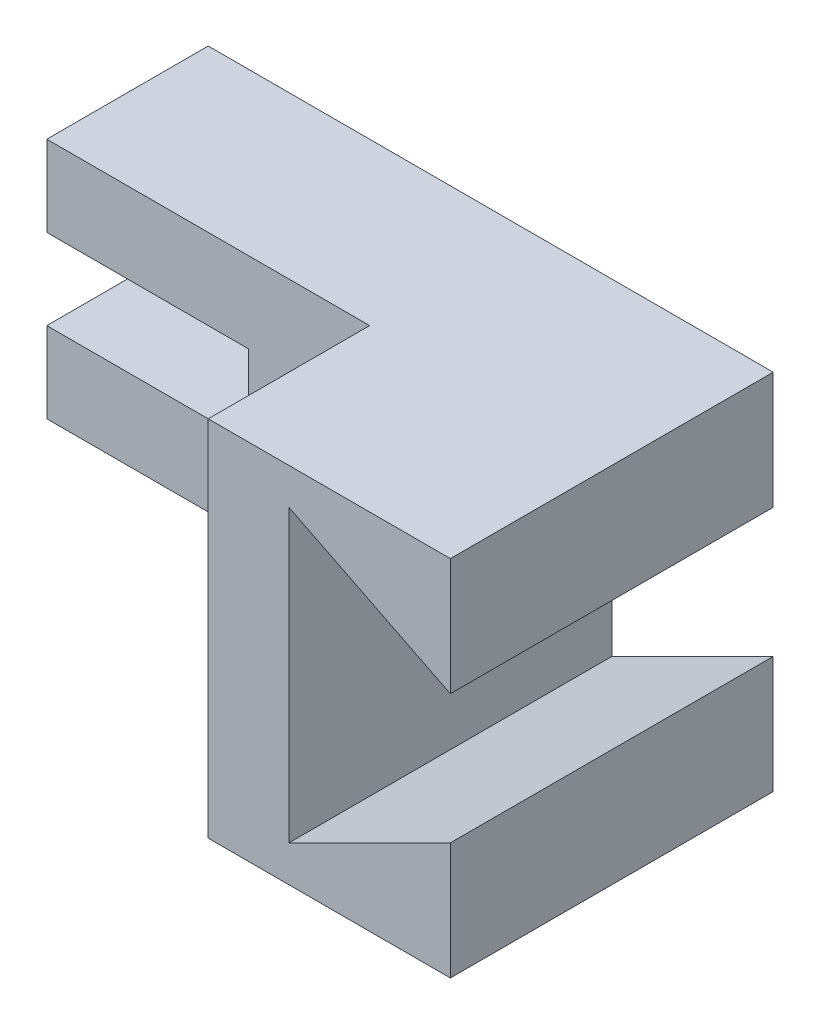
ISO-10303-21;
HEADER;
FILE_DESCRIPTION(('STEP AP214'),'2;1');
FILE_NAME('part.step','',(''),(''),'','','');
FILE_SCHEMA(('AUTOMOTIVE_DESIGN { 1 0 10303 214 1 1 1 1 }'));
ENDSEC;
DATA;
#1=APPLICATION_CONTEXT('core data for automotive mechanical design processes');
#2=APPLICATION_PROTOCOL_DEFINITION('international standard','automotive_design',2000,#1);
#3=PRODUCT_CONTEXT('',#1,'mechanical');
#4=PRODUCT('Part','Part','',(#3));
#5=PRODUCT_RELATED_PRODUCT_CATEGORY('part','',(#4));
#6=PRODUCT_DEFINITION_FORMATION('','',#4);
#7=PRODUCT_DEFINITION_CONTEXT('part definition',#1,'design');
#8=PRODUCT_DEFINITION('design','',#6,#7);
#9=PRODUCT_DEFINITION_SHAPE('','',#8);
#10=(LENGTH_UNIT() NAMED_UNIT(*) SI_UNIT(.MILLI.,.METRE.));
#11=(NAMED_UNIT(*) PLANE_ANGLE_UNIT() SI_UNIT($,.RADIAN.));
#12=(NAMED_UNIT(*) SI_UNIT($,.STERADIAN.) SOLID_ANGLE_UNIT());
#13=UNCERTAINTY_MEASURE_WITH_UNIT(LENGTH_MEASURE(1.E-05),#10,'distance_accuracy_value','');
#14=(GEOMETRIC_REPRESENTATION_CONTEXT(3) GLOBAL_UNCERTAINTY_ASSIGNED_CONTEXT((#13)) GLOBAL_UNIT_ASSIGNED_CONTEXT((#10,
#11,#12)) REPRESENTATION_CONTEXT('',''));
#15=CARTESIAN_POINT('',(0.,0.,0.));
#16=DIRECTION('',(0.,0.,1.));
#17=DIRECTION('',(1.,0.,0.));
#18=AXIS2_PLACEMENT_3D('',#15,#16,#17);
#19=CARTESIAN_POINT('',(0.,0.,0.));
#20=DIRECTION('',(0.,0.,1.));
#21=DIRECTION('',(1.,0.,0.));
#22=AXIS2_PLACEMENT_3D('',#19,#20,#21);
#23=PLANE('',#22);
#24=DIRECTION('',(0.894427190999916,-0.447213595499958,0.));
#25=VECTOR('',#24,1.);
#26=CARTESIAN_POINT('',(70.,15.5,0.));
#27=LINE('',#26,#25);
#28=CARTESIAN_POINT('',(50.,25.5,0.));
#29=VERTEX_POINT('',#28);
#30=CARTESIAN_POINT('',(70.,15.5,0.));
#31=VERTEX_POINT('',#30);
#32=EDGE_CURVE('E55',#29,#31,#27,.T.);
#33=ORIENTED_EDGE('',*,*,#32,.F.);
#34=DIRECTION('',(0.,1.,0.));
#35=VECTOR('',#34,1.);
#36=CARTESIAN_POINT('',(50.,25.5,0.));
#37=LINE('',#36,#35);
#38=CARTESIAN_POINT('',(50.,-10.5,0.));
#39=VERTEX_POINT('',#38);
#40=EDGE_CURVE('E59',#39,#29,#37,.T.);
#41=ORIENTED_EDGE('',*,*,#40,.F.);
#42=DIRECTION('',(-0.894427190999916,-0.447213595499958,0.));
#43=VECTOR('',#42,1.);
#44=CARTESIAN_POINT('',(50.,-10.5,0.));
#45=LINE('',#44,#43);
#46=CARTESIAN_POINT('',(70.,-0.499999999999997,0.));
#47=VERTEX_POINT('',#46);
#48=EDGE_CURVE('E172',#47,#39,#45,.T.);
#49=ORIENTED_EDGE('',*,*,#48,.F.);
#50=DIRECTION('',(0.,1.,0.));
#51=VECTOR('',#50,1.);
#52=CARTESIAN_POINT('',(70.,30.,0.));
#53=LINE('',#52,#51);
#54=CARTESIAN_POINT('',(70.,-15.,0.));
#55=VERTEX_POINT('',#54);
#56=EDGE_CURVE('E189',#55,#47,#53,.T.);
#57=ORIENTED_EDGE('',*,*,#56,.F.);
#58=DIRECTION('',(-1.,0.,0.));
#59=VECTOR('',#58,1.);
#60=CARTESIAN_POINT('',(70.,-15.,0.));
#61=LINE('',#60,#59);
#62=CARTESIAN_POINT('',(40.,-15.,0.));
#63=VERTEX_POINT('',#62);
#64=EDGE_CURVE('E198',#55,#63,#61,.T.);
#65=ORIENTED_EDGE('',*,*,#64,.T.);
#66=DIRECTION('',(0.,1.,0.));
#67=VECTOR('',#66,1.);
#68=CARTESIAN_POINT('',(40.,30.,0.));
#69=LINE('',#68,#67);
#70=CARTESIAN_POINT('',(40.,0.,0.));
#71=VERTEX_POINT('',#70);
#72=EDGE_CURVE('E188',#63,#71,#69,.T.);
#73=ORIENTED_EDGE('',*,*,#72,.T.);
#74=DIRECTION('',(1.,0.,0.));
#75=VECTOR('',#74,1.);
#76=CARTESIAN_POINT('',(0.,0.,0.));
#77=LINE('',#76,#75);
#78=CARTESIAN_POINT('',(0.,0.,0.));
#79=VERTEX_POINT('',#78);
#80=EDGE_CURVE('E252',#79,#71,#77,.T.);
#81=ORIENTED_EDGE('',*,*,#80,.F.);
#82=DIRECTION('',(0.,-1.,0.));
#83=VECTOR('',#82,1.);
#84=CARTESIAN_POINT('',(0.,10.,0.));
#85=LINE('',#84,#83);
#86=CARTESIAN_POINT('',(0.,10.,0.));
#87=VERTEX_POINT('',#86);
#88=EDGE_CURVE('E221',#87,#79,#85,.T.);
#89=ORIENTED_EDGE('',*,*,#88,.F.);
#90=DIRECTION('',(-1.,0.,0.));
#91=VECTOR('',#90,1.);
#92=CARTESIAN_POINT('',(25.,10.,0.));
#93=LINE('',#92,#91);
#94=CARTESIAN_POINT('',(25.,10.,0.));
#95=VERTEX_POINT('',#94);
#96=EDGE_CURVE('E227',#95,#87,#93,.T.);
#97=ORIENTED_EDGE('',*,*,#96,.F.);
#98=DIRECTION('',(0.,-1.,0.));
#99=VECTOR('',#98,1.);
#100=CARTESIAN_POINT('',(25.,20.,0.));
#101=LINE('',#100,#99);
#102=CARTESIAN_POINT('',(25.,20.,0.));
#103=VERTEX_POINT('',#102);
#104=EDGE_CURVE('E264',#103,#95,#101,.T.);
#105=ORIENTED_EDGE('',*,*,#104,.F.);
#106=DIRECTION('',(1.,0.,0.));
#107=VECTOR('',#106,1.);
#108=CARTESIAN_POINT('',(0.,20.,0.));
#109=LINE('',#108,#107);
#110=CARTESIAN_POINT('',(0.,20.,0.));
#111=VERTEX_POINT('',#110);
#112=EDGE_CURVE('E261',#111,#103,#109,.T.);
#113=ORIENTED_EDGE('',*,*,#112,.F.);
#114=DIRECTION('',(0.,-1.,0.));
#115=VECTOR('',#114,1.);
#116=CARTESIAN_POINT('',(0.,30.,0.));
#117=LINE('',#116,#115);
#118=CARTESIAN_POINT('',(0.,30.,0.));
#119=VERTEX_POINT('',#118);
#120=EDGE_CURVE('E258',#119,#111,#117,.T.);
#121=ORIENTED_EDGE('',*,*,#120,.F.);
#122=DIRECTION('',(-1.,0.,0.));
#123=VECTOR('',#122,1.);
#124=CARTESIAN_POINT('',(40.,30.,0.));
#125=LINE('',#124,#123);
#126=CARTESIAN_POINT('',(70.,30.,0.));
#127=VERTEX_POINT('',#126);
#128=EDGE_CURVE('E255',#127,#119,#125,.T.);
#129=ORIENTED_EDGE('',*,*,#128,.F.);
#130=EDGE_CURVE('E193',#31,#127,#53,.T.);
#131=ORIENTED_EDGE('',*,*,#130,.F.);
#132=EDGE_LOOP('',(#33,#41,#49,#57,#65,#73,#81,#89,#97,#105,#113,#121,#129,#131));
#133=FACE_BOUND('',#132,.T.);
#134=ADVANCED_FACE('F39',(#133),#23,.F.);
#135=CARTESIAN_POINT('',(70.,30.,40.));
#136=DIRECTION('',(0.,0.,-1.));
#137=DIRECTION('',(-1.,0.,0.));
#138=AXIS2_PLACEMENT_3D('',#135,#136,#137);
#139=PLANE('',#138);
#140=DIRECTION('',(-0.894427190999916,-0.447213595499958,0.));
#141=VECTOR('',#140,1.);
#142=CARTESIAN_POINT('',(50.,-10.5,40.));
#143=LINE('',#142,#141);
#144=CARTESIAN_POINT('',(70.,-0.5,40.));
#145=VERTEX_POINT('',#144);
#146=CARTESIAN_POINT('',(50.,-10.5,40.));
#147=VERTEX_POINT('',#146);
#148=EDGE_CURVE('E483',#145,#147,#143,.T.);
#149=ORIENTED_EDGE('',*,*,#148,.T.);
#150=DIRECTION('',(0.,1.,0.));
#151=VECTOR('',#150,1.);
#152=CARTESIAN_POINT('',(50.,25.5,40.));
#153=LINE('',#152,#151);
#154=CARTESIAN_POINT('',(50.,25.5,40.));
#155=VERTEX_POINT('',#154);
#156=EDGE_CURVE('E163',#147,#155,#153,.T.);
#157=ORIENTED_EDGE('',*,*,#156,.T.);
#158=DIRECTION('',(0.894427190999916,-0.447213595499958,0.));
#159=VECTOR('',#158,1.);
#160=CARTESIAN_POINT('',(70.,15.5,40.));
#161=LINE('',#160,#159);
#162=CARTESIAN_POINT('',(70.,15.5,40.));
#163=VERTEX_POINT('',#162);
#164=EDGE_CURVE('E160',#155,#163,#161,.T.);
#165=ORIENTED_EDGE('',*,*,#164,.T.);
#166=DIRECTION('',(0.,-1.,0.));
#167=VECTOR('',#166,1.);
#168=CARTESIAN_POINT('',(70.,30.,40.));
#169=LINE('',#168,#167);
#170=CARTESIAN_POINT('',(70.,30.,40.));
#171=VERTEX_POINT('',#170);
#172=EDGE_CURVE('E145',#171,#163,#169,.T.);
#173=ORIENTED_EDGE('',*,*,#172,.F.);
#174=DIRECTION('',(-1.,0.,0.));
#175=VECTOR('',#174,1.);
#176=CARTESIAN_POINT('',(70.,30.,40.));
#177=LINE('',#176,#175);
#178=CARTESIAN_POINT('',(40.,30.,40.));
#179=VERTEX_POINT('',#178);
#180=EDGE_CURVE('E218',#171,#179,#177,.T.);
#181=ORIENTED_EDGE('',*,*,#180,.T.);
#182=DIRECTION('',(0.,-1.,0.));
#183=VECTOR('',#182,1.);
#184=CARTESIAN_POINT('',(40.,30.,40.));
#185=LINE('',#184,#183);
#186=CARTESIAN_POINT('',(40.,-15.,40.));
#187=VERTEX_POINT('',#186);
#188=EDGE_CURVE('E205',#179,#187,#185,.T.);
#189=ORIENTED_EDGE('',*,*,#188,.T.);
#190=DIRECTION('',(-1.,0.,0.));
#191=VECTOR('',#190,1.);
#192=CARTESIAN_POINT('',(70.,-15.,40.));
#193=LINE('',#192,#191);
#194=CARTESIAN_POINT('',(70.,-15.,40.));
#195=VERTEX_POINT('',#194);
#196=EDGE_CURVE('E214',#195,#187,#193,.T.);
#197=ORIENTED_EDGE('',*,*,#196,.F.);
#198=EDGE_CURVE('E157',#145,#195,#169,.T.);
#199=ORIENTED_EDGE('',*,*,#198,.F.);
#200=EDGE_LOOP('',(#149,#157,#165,#173,#181,#189,#197,#199));
#201=FACE_BOUND('',#200,.T.);
#202=ADVANCED_FACE('F161',(#201),#139,.F.);
#203=CARTESIAN_POINT('',(70.,0.,0.));
#204=DIRECTION('',(-1.,0.,0.));
#205=DIRECTION('',(0.,0.,1.));
#206=AXIS2_PLACEMENT_3D('',#203,#204,#205);
#207=PLANE('',#206);
#208=DIRECTION('',(0.,0.,-1.));
#209=VECTOR('',#208,1.);
#210=CARTESIAN_POINT('',(70.,-0.500000000000006,205.413658203871));
#211=LINE('',#210,#209);
#212=EDGE_CURVE('E176',#145,#47,#211,.T.);
#213=ORIENTED_EDGE('',*,*,#212,.F.);
#214=ORIENTED_EDGE('',*,*,#198,.T.);
#215=DIRECTION('',(0.,0.,-1.));
#216=VECTOR('',#215,1.);
#217=CARTESIAN_POINT('',(70.,-15.,0.));
#218=LINE('',#217,#216);
#219=EDGE_CURVE('E156',#195,#55,#218,.T.);
#220=ORIENTED_EDGE('',*,*,#219,.T.);
#221=ORIENTED_EDGE('',*,*,#56,.T.);
#222=EDGE_LOOP('',(#213,#214,#220,#221));
#223=FACE_BOUND('',#222,.T.);
#224=ADVANCED_FACE('F350',(#223),#207,.F.);
#225=DIRECTION('',(0.,0.,-1.));
#226=VECTOR('',#225,1.);
#227=CARTESIAN_POINT('',(70.,15.5,205.413658203871));
#228=LINE('',#227,#226);
#229=EDGE_CURVE('E149',#163,#31,#228,.T.);
#230=ORIENTED_EDGE('',*,*,#229,.T.);
#231=ORIENTED_EDGE('',*,*,#130,.T.);
#232=DIRECTION('',(0.,0.,1.));
#233=VECTOR('',#232,1.);
#234=CARTESIAN_POINT('',(70.,30.,0.));
#235=LINE('',#234,#233);
#236=EDGE_CURVE('E151',#127,#171,#235,.T.);
#237=ORIENTED_EDGE('',*,*,#236,.T.);
#238=ORIENTED_EDGE('',*,*,#172,.T.);
#239=EDGE_LOOP('',(#230,#231,#237,#238));
#240=FACE_BOUND('',#239,.T.);
#241=ADVANCED_FACE('F147',(#240),#207,.F.);
#242=CARTESIAN_POINT('',(0.,10.,20.));
#243=DIRECTION('',(1.,0.,0.));
#244=DIRECTION('',(0.,0.,-1.));
#245=AXIS2_PLACEMENT_3D('',#242,#243,#244);
#246=PLANE('',#245);
#247=ORIENTED_EDGE('',*,*,#88,.T.);
#248=DIRECTION('',(0.,0.,-1.));
#249=VECTOR('',#248,1.);
#250=CARTESIAN_POINT('',(0.,0.,20.));
#251=LINE('',#250,#249);
#252=CARTESIAN_POINT('',(0.,0.,20.));
#253=VERTEX_POINT('',#252);
#254=EDGE_CURVE('E11',#253,#79,#251,.T.);
#255=ORIENTED_EDGE('',*,*,#254,.F.);
#256=DIRECTION('',(0.,-1.,0.));
#257=VECTOR('',#256,1.);
#258=CARTESIAN_POINT('',(0.,10.,20.));
#259=LINE('',#258,#257);
#260=CARTESIAN_POINT('',(0.,10.,20.));
#261=VERTEX_POINT('',#260);
#262=EDGE_CURVE('E222',#261,#253,#259,.T.);
#263=ORIENTED_EDGE('',*,*,#262,.F.);
#264=DIRECTION('',(0.,0.,-1.));
#265=VECTOR('',#264,1.);
#266=CARTESIAN_POINT('',(0.,10.,20.));
#267=LINE('',#266,#265);
#268=EDGE_CURVE('E248',#261,#87,#267,.T.);
#269=ORIENTED_EDGE('',*,*,#268,.T.);
#270=EDGE_LOOP('',(#247,#255,#263,#269));
#271=FACE_BOUND('',#270,.T.);
#272=ADVANCED_FACE('F41',(#271),#246,.F.);
#273=CARTESIAN_POINT('',(0.,0.,20.));
#274=DIRECTION('',(0.,1.,0.));
#275=DIRECTION('',(0.,0.,1.));
#276=AXIS2_PLACEMENT_3D('',#273,#274,#275);
#277=PLANE('',#276);
#278=ORIENTED_EDGE('',*,*,#80,.T.);
#279=DIRECTION('',(0.,0.,-1.));
#280=VECTOR('',#279,1.);
#281=CARTESIAN_POINT('',(40.,0.,20.));
#282=LINE('',#281,#280);
#283=CARTESIAN_POINT('',(40.,0.,20.));
#284=VERTEX_POINT('',#283);
#285=EDGE_CURVE('E48',#284,#71,#282,.T.);
#286=ORIENTED_EDGE('',*,*,#285,.F.);
#287=DIRECTION('',(1.,0.,0.));
#288=VECTOR('',#287,1.);
#289=CARTESIAN_POINT('',(0.,0.,20.));
#290=LINE('',#289,#288);
#291=EDGE_CURVE('E226',#253,#284,#290,.T.);
#292=ORIENTED_EDGE('',*,*,#291,.F.);
#293=ORIENTED_EDGE('',*,*,#254,.T.);
#294=EDGE_LOOP('',(#278,#286,#292,#293));
#295=FACE_BOUND('',#294,.T.);
#296=ADVANCED_FACE('F316',(#295),#277,.F.);
#297=CARTESIAN_POINT('',(40.,30.,20.));
#298=DIRECTION('',(0.,-1.,0.));
#299=DIRECTION('',(0.,0.,-1.));
#300=AXIS2_PLACEMENT_3D('',#297,#298,#299);
#301=PLANE('',#300);
#302=ORIENTED_EDGE('',*,*,#128,.T.);
#303=DIRECTION('',(0.,0.,-1.));
#304=VECTOR('',#303,1.);
#305=CARTESIAN_POINT('',(0.,30.,20.));
#306=LINE('',#305,#304);
#307=CARTESIAN_POINT('',(0.,30.,20.));
#308=VERTEX_POINT('',#307);
#309=EDGE_CURVE('E284',#308,#119,#306,.T.);
#310=ORIENTED_EDGE('',*,*,#309,.F.);
#311=DIRECTION('',(-1.,0.,0.));
#312=VECTOR('',#311,1.);
#313=CARTESIAN_POINT('',(40.,30.,20.));
#314=LINE('',#313,#312);
#315=CARTESIAN_POINT('',(40.,30.,20.));
#316=VERTEX_POINT('',#315);
#317=EDGE_CURVE('E233',#316,#308,#314,.T.);
#318=ORIENTED_EDGE('',*,*,#317,.F.);
#319=DIRECTION('',(0.,0.,1.));
#320=VECTOR('',#319,1.);
#321=CARTESIAN_POINT('',(40.,30.,0.));
#322=LINE('',#321,#320);
#323=EDGE_CURVE('E202',#316,#179,#322,.T.);
#324=ORIENTED_EDGE('',*,*,#323,.T.);
#325=ORIENTED_EDGE('',*,*,#180,.F.);
#326=ORIENTED_EDGE('',*,*,#236,.F.);
#327=EDGE_LOOP('',(#302,#310,#318,#324,#325,#326));
#328=FACE_BOUND('',#327,.T.);
#329=ADVANCED_FACE('F307',(#328),#301,.F.);
#330=CARTESIAN_POINT('',(0.,30.,20.));
#331=DIRECTION('',(1.,0.,0.));
#332=DIRECTION('',(0.,0.,-1.));
#333=AXIS2_PLACEMENT_3D('',#330,#331,#332);
#334=PLANE('',#333);
#335=ORIENTED_EDGE('',*,*,#120,.T.);
#336=DIRECTION('',(0.,0.,-1.));
#337=VECTOR('',#336,1.);
#338=CARTESIAN_POINT('',(0.,20.,20.));
#339=LINE('',#338,#337);
#340=CARTESIAN_POINT('',(0.,20.,20.));
#341=VERTEX_POINT('',#340);
#342=EDGE_CURVE('E280',#341,#111,#339,.T.);
#343=ORIENTED_EDGE('',*,*,#342,.F.);
#344=DIRECTION('',(0.,-1.,0.));
#345=VECTOR('',#344,1.);
#346=CARTESIAN_POINT('',(0.,30.,20.));
#347=LINE('',#346,#345);
#348=EDGE_CURVE('E236',#308,#341,#347,.T.);
#349=ORIENTED_EDGE('',*,*,#348,.F.);
#350=ORIENTED_EDGE('',*,*,#309,.T.);
#351=EDGE_LOOP('',(#335,#343,#349,#350));
#352=FACE_BOUND('',#351,.T.);
#353=ADVANCED_FACE('F336',(#352),#334,.F.);
#354=CARTESIAN_POINT('',(0.,20.,20.));
#355=DIRECTION('',(0.,1.,0.));
#356=DIRECTION('',(-1.,0.,0.));
#357=AXIS2_PLACEMENT_3D('',#354,#355,#356);
#358=PLANE('',#357);
#359=ORIENTED_EDGE('',*,*,#112,.T.);
#360=DIRECTION('',(0.,0.,-1.));
#361=VECTOR('',#360,1.);
#362=CARTESIAN_POINT('',(25.,20.,20.));
#363=LINE('',#362,#361);
#364=CARTESIAN_POINT('',(25.,20.,20.));
#365=VERTEX_POINT('',#364);
#366=EDGE_CURVE('E276',#365,#103,#363,.T.);
#367=ORIENTED_EDGE('',*,*,#366,.F.);
#368=DIRECTION('',(1.,0.,0.));
#369=VECTOR('',#368,1.);
#370=CARTESIAN_POINT('',(0.,20.,20.));
#371=LINE('',#370,#369);
#372=EDGE_CURVE('E239',#341,#365,#371,.T.);
#373=ORIENTED_EDGE('',*,*,#372,.F.);
#374=ORIENTED_EDGE('',*,*,#342,.T.);
#375=EDGE_LOOP('',(#359,#367,#373,#374));
#376=FACE_BOUND('',#375,.T.);
#377=ADVANCED_FACE('F332',(#376),#358,.F.);
#378=CARTESIAN_POINT('',(25.,20.,20.));
#379=DIRECTION('',(1.,0.,0.));
#380=DIRECTION('',(0.,0.,-1.));
#381=AXIS2_PLACEMENT_3D('',#378,#379,#380);
#382=PLANE('',#381);
#383=ORIENTED_EDGE('',*,*,#104,.T.);
#384=DIRECTION('',(0.,0.,-1.));
#385=VECTOR('',#384,1.);
#386=CARTESIAN_POINT('',(25.,10.,20.));
#387=LINE('',#386,#385);
#388=CARTESIAN_POINT('',(25.,10.,20.));
#389=VERTEX_POINT('',#388);
#390=EDGE_CURVE('E272',#389,#95,#387,.T.);
#391=ORIENTED_EDGE('',*,*,#390,.F.);
#392=DIRECTION('',(0.,-1.,0.));
#393=VECTOR('',#392,1.);
#394=CARTESIAN_POINT('',(25.,20.,20.));
#395=LINE('',#394,#393);
#396=EDGE_CURVE('E242',#365,#389,#395,.T.);
#397=ORIENTED_EDGE('',*,*,#396,.F.);
#398=ORIENTED_EDGE('',*,*,#366,.T.);
#399=EDGE_LOOP('',(#383,#391,#397,#398));
#400=FACE_BOUND('',#399,.T.);
#401=ADVANCED_FACE('F328',(#400),#382,.F.);
#402=CARTESIAN_POINT('',(25.,10.,20.));
#403=DIRECTION('',(0.,-1.,0.));
#404=DIRECTION('',(1.,0.,0.));
#405=AXIS2_PLACEMENT_3D('',#402,#403,#404);
#406=PLANE('',#405);
#407=ORIENTED_EDGE('',*,*,#96,.T.);
#408=ORIENTED_EDGE('',*,*,#268,.F.);
#409=DIRECTION('',(-1.,0.,0.));
#410=VECTOR('',#409,1.);
#411=CARTESIAN_POINT('',(25.,10.,20.));
#412=LINE('',#411,#410);
#413=EDGE_CURVE('E245',#389,#261,#412,.T.);
#414=ORIENTED_EDGE('',*,*,#413,.F.);
#415=ORIENTED_EDGE('',*,*,#390,.T.);
#416=EDGE_LOOP('',(#407,#408,#414,#415));
#417=FACE_BOUND('',#416,.T.);
#418=ADVANCED_FACE('F323',(#417),#406,.F.);
#419=CARTESIAN_POINT('',(0.,0.,20.));
#420=DIRECTION('',(0.,0.,1.));
#421=DIRECTION('',(1.,0.,0.));
#422=AXIS2_PLACEMENT_3D('',#419,#420,#421);
#423=PLANE('',#422);
#424=ORIENTED_EDGE('',*,*,#262,.T.);
#425=ORIENTED_EDGE('',*,*,#291,.T.);
#426=DIRECTION('',(0.,1.,0.));
#427=VECTOR('',#426,1.);
#428=CARTESIAN_POINT('',(40.,0.,20.));
#429=LINE('',#428,#427);
#430=EDGE_CURVE('E230',#284,#316,#429,.T.);
#431=ORIENTED_EDGE('',*,*,#430,.T.);
#432=ORIENTED_EDGE('',*,*,#317,.T.);
#433=ORIENTED_EDGE('',*,*,#348,.T.);
#434=ORIENTED_EDGE('',*,*,#372,.T.);
#435=ORIENTED_EDGE('',*,*,#396,.T.);
#436=ORIENTED_EDGE('',*,*,#413,.T.);
#437=EDGE_LOOP('',(#424,#425,#431,#432,#433,#434,#435,#436));
#438=FACE_BOUND('',#437,.T.);
#439=ADVANCED_FACE('F312',(#438),#423,.T.);
#440=CARTESIAN_POINT('',(40.,0.,0.));
#441=DIRECTION('',(-1.,0.,0.));
#442=DIRECTION('',(0.,0.,1.));
#443=AXIS2_PLACEMENT_3D('',#440,#441,#442);
#444=PLANE('',#443);
#445=ORIENTED_EDGE('',*,*,#430,.F.);
#446=ORIENTED_EDGE('',*,*,#285,.T.);
#447=ORIENTED_EDGE('',*,*,#72,.F.);
#448=DIRECTION('',(0.,0.,-1.));
#449=VECTOR('',#448,1.);
#450=CARTESIAN_POINT('',(40.,-15.,0.));
#451=LINE('',#450,#449);
#452=EDGE_CURVE('E208',#187,#63,#451,.T.);
#453=ORIENTED_EDGE('',*,*,#452,.F.);
#454=ORIENTED_EDGE('',*,*,#188,.F.);
#455=ORIENTED_EDGE('',*,*,#323,.F.);
#456=EDGE_LOOP('',(#445,#446,#447,#453,#454,#455));
#457=FACE_BOUND('',#456,.T.);
#458=ADVANCED_FACE('F293',(#457),#444,.T.);
#459=CARTESIAN_POINT('',(70.,-15.,0.));
#460=DIRECTION('',(0.,1.,0.));
#461=DIRECTION('',(0.,0.,1.));
#462=AXIS2_PLACEMENT_3D('',#459,#460,#461);
#463=PLANE('',#462);
#464=ORIENTED_EDGE('',*,*,#452,.T.);
#465=ORIENTED_EDGE('',*,*,#64,.F.);
#466=ORIENTED_EDGE('',*,*,#219,.F.);
#467=ORIENTED_EDGE('',*,*,#196,.T.);
#468=EDGE_LOOP('',(#464,#465,#466,#467));
#469=FACE_BOUND('',#468,.T.);
#470=ADVANCED_FACE('F302',(#469),#463,.F.);
#471=CARTESIAN_POINT('',(50.,-10.5,205.413658203871));
#472=DIRECTION('',(-0.447213595499958,0.894427190999916,0.));
#473=DIRECTION('',(-0.894427190999916,-0.447213595499958,0.));
#474=AXIS2_PLACEMENT_3D('',#471,#472,#473);
#475=PLANE('',#474);
#476=ORIENTED_EDGE('',*,*,#148,.F.);
#477=ORIENTED_EDGE('',*,*,#212,.T.);
#478=ORIENTED_EDGE('',*,*,#48,.T.);
#479=DIRECTION('',(0.,0.,-1.));
#480=VECTOR('',#479,1.);
#481=CARTESIAN_POINT('',(50.,-10.5,205.413658203871));
#482=LINE('',#481,#480);
#483=EDGE_CURVE('E184',#147,#39,#482,.T.);
#484=ORIENTED_EDGE('',*,*,#483,.F.);
#485=EDGE_LOOP('',(#476,#477,#478,#484));
#486=FACE_BOUND('',#485,.T.);
#487=ADVANCED_FACE('F384',(#486),#475,.T.);
#488=CARTESIAN_POINT('',(50.,25.5,205.413658203871));
#489=DIRECTION('',(1.,0.,0.));
#490=DIRECTION('',(0.,1.,0.));
#491=AXIS2_PLACEMENT_3D('',#488,#489,#490);
#492=PLANE('',#491);
#493=ORIENTED_EDGE('',*,*,#156,.F.);
#494=ORIENTED_EDGE('',*,*,#483,.T.);
#495=ORIENTED_EDGE('',*,*,#40,.T.);
#496=DIRECTION('',(0.,0.,-1.));
#497=VECTOR('',#496,1.);
#498=CARTESIAN_POINT('',(50.,25.5,205.413658203871));
#499=LINE('',#498,#497);
#500=EDGE_CURVE('E171',#155,#29,#499,.T.);
#501=ORIENTED_EDGE('',*,*,#500,.F.);
#502=EDGE_LOOP('',(#493,#494,#495,#501));
#503=FACE_BOUND('',#502,.T.);
#504=ADVANCED_FACE('F391',(#503),#492,.T.);
#505=CARTESIAN_POINT('',(70.,15.5,205.413658203871));
#506=DIRECTION('',(-0.447213595499958,-0.894427190999916,0.));
#507=DIRECTION('',(0.894427190999916,-0.447213595499958,0.));
#508=AXIS2_PLACEMENT_3D('',#505,#506,#507);
#509=PLANE('',#508);
#510=ORIENTED_EDGE('',*,*,#164,.F.);
#511=ORIENTED_EDGE('',*,*,#500,.T.);
#512=ORIENTED_EDGE('',*,*,#32,.T.);
#513=ORIENTED_EDGE('',*,*,#229,.F.);
#514=EDGE_LOOP('',(#510,#511,#512,#513));
#515=FACE_BOUND('',#514,.T.);
#516=ADVANCED_FACE('F169',(#515),#509,.T.);
#517=CLOSED_SHELL('',(#134,#202,#224,#241,#272,#296,#329,#353,#377,#401,#418,#439,#458,#470,
#487,#504,#516));
#518=MANIFOLD_SOLID_BREP('B2',#517);
#519=ADVANCED_BREP_SHAPE_REPRESENTATION('',(#18,#518),#14);
#520=SHAPE_DEFINITION_REPRESENTATION(#9,#519);
ENDSEC;
END-ISO-10303-21;
